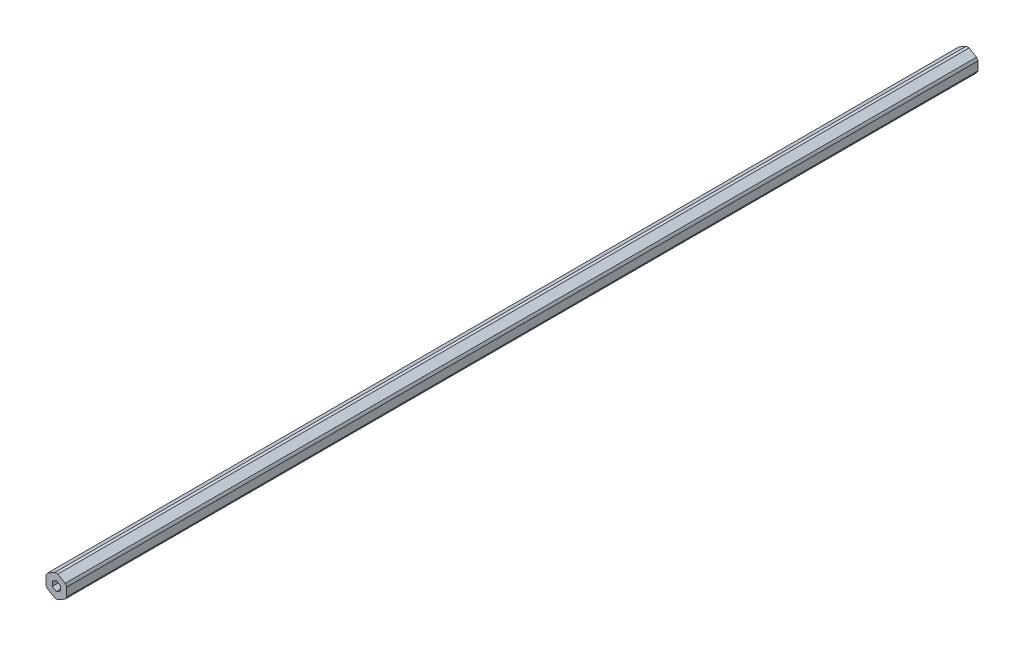
ISO-10303-21;
HEADER;
FILE_DESCRIPTION(('STEP AP214'),'2;1');
FILE_NAME('part.step','',(''),(''),'','','');
FILE_SCHEMA(('AUTOMOTIVE_DESIGN { 1 0 10303 214 1 1 1 1 }'));
ENDSEC;
DATA;
#1=APPLICATION_CONTEXT('core data for automotive mechanical design processes');
#2=APPLICATION_PROTOCOL_DEFINITION('international standard','automotive_design',2000,#1);
#3=PRODUCT_CONTEXT('',#1,'mechanical');
#4=PRODUCT('Part','Part','',(#3));
#5=PRODUCT_RELATED_PRODUCT_CATEGORY('part','',(#4));
#6=PRODUCT_DEFINITION_FORMATION('','',#4);
#7=PRODUCT_DEFINITION_CONTEXT('part definition',#1,'design');
#8=PRODUCT_DEFINITION('design','',#6,#7);
#9=PRODUCT_DEFINITION_SHAPE('','',#8);
#10=(LENGTH_UNIT() NAMED_UNIT(*) SI_UNIT(.MILLI.,.METRE.));
#11=(NAMED_UNIT(*) PLANE_ANGLE_UNIT() SI_UNIT($,.RADIAN.));
#12=(NAMED_UNIT(*) SI_UNIT($,.STERADIAN.) SOLID_ANGLE_UNIT());
#13=UNCERTAINTY_MEASURE_WITH_UNIT(LENGTH_MEASURE(1.E-05),#10,'distance_accuracy_value','');
#14=(GEOMETRIC_REPRESENTATION_CONTEXT(3) GLOBAL_UNCERTAINTY_ASSIGNED_CONTEXT((#13)) GLOBAL_UNIT_ASSIGNED_CONTEXT((#10,
#11,#12)) REPRESENTATION_CONTEXT('',''));
#15=CARTESIAN_POINT('',(0.,0.,0.));
#16=DIRECTION('',(0.,0.,1.));
#17=DIRECTION('',(1.,0.,0.));
#18=AXIS2_PLACEMENT_3D('',#15,#16,#17);
#19=CARTESIAN_POINT('',(0.,0.,457.2));
#20=DIRECTION('',(0.,0.,-1.));
#21=DIRECTION('',(-1.,0.,0.));
#22=AXIS2_PLACEMENT_3D('',#19,#20,#21);
#23=CYLINDRICAL_SURFACE('',#22,6.87);
#24=DIRECTION('',(0.,0.,-1.));
#25=VECTOR('',#24,1.);
#26=CARTESIAN_POINT('',(6.345,-2.63398462410091,457.2));
#27=LINE('',#26,#25);
#28=CARTESIAN_POINT('',(6.345,-2.63398462410091,101.6));
#29=VERTEX_POINT('',#28);
#30=CARTESIAN_POINT('',(6.345,-2.63398462410091,-457.2));
#31=VERTEX_POINT('',#30);
#32=EDGE_CURVE('E303',#29,#31,#27,.T.);
#33=ORIENTED_EDGE('',*,*,#32,.F.);
#34=CARTESIAN_POINT('',(0.,0.,101.6));
#35=DIRECTION('',(0.,0.,1.));
#36=DIRECTION('',(1.,0.,0.));
#37=AXIS2_PLACEMENT_3D('',#34,#35,#36);
#38=CIRCLE('',#37,6.87);
#39=CARTESIAN_POINT('',(5.45359759764899,-4.17793887496181,101.6));
#40=VERTEX_POINT('',#39);
#41=EDGE_CURVE('E247',#40,#29,#38,.T.);
#42=ORIENTED_EDGE('',*,*,#41,.F.);
#43=DIRECTION('',(0.,0.,-1.));
#44=VECTOR('',#43,1.);
#45=CARTESIAN_POINT('',(5.45359759764899,-4.17793887496181,457.2));
#46=LINE('',#45,#44);
#47=CARTESIAN_POINT('',(5.45359759764899,-4.17793887496181,-457.2));
#48=VERTEX_POINT('',#47);
#49=EDGE_CURVE('E57',#40,#48,#46,.T.);
#50=ORIENTED_EDGE('',*,*,#49,.T.);
#51=CARTESIAN_POINT('',(0.,0.,-457.2));
#52=DIRECTION('',(0.,0.,1.));
#53=DIRECTION('',(1.,0.,0.));
#54=AXIS2_PLACEMENT_3D('',#51,#52,#53);
#55=CIRCLE('',#54,6.87);
#56=EDGE_CURVE('E11',#48,#31,#55,.T.);
#57=ORIENTED_EDGE('',*,*,#56,.T.);
#58=EDGE_LOOP('',(#33,#42,#50,#57));
#59=FACE_BOUND('',#58,.T.);
#60=ADVANCED_FACE('F47',(#59),#23,.T.);
#61=CARTESIAN_POINT('',(3.1725,-5.49493118701227,457.2));
#62=DIRECTION('',(-0.5,0.866025403784439,0.));
#63=DIRECTION('',(0.,0.,1.));
#64=AXIS2_PLACEMENT_3D('',#61,#62,#63);
#65=PLANE('',#64);
#66=DIRECTION('',(0.866025403784438,0.5,0.));
#67=VECTOR('',#66,1.);
#68=CARTESIAN_POINT('',(0.891402402351005,-6.81192349906272,101.6));
#69=LINE('',#68,#67);
#70=CARTESIAN_POINT('',(0.891402402351005,-6.81192349906272,101.6));
#71=VERTEX_POINT('',#70);
#72=EDGE_CURVE('E291',#71,#40,#69,.T.);
#73=ORIENTED_EDGE('',*,*,#72,.F.);
#74=DIRECTION('',(0.,0.,-1.));
#75=VECTOR('',#74,1.);
#76=CARTESIAN_POINT('',(0.891402402351008,-6.81192349906272,457.2));
#77=LINE('',#76,#75);
#78=CARTESIAN_POINT('',(0.891402402351008,-6.81192349906272,-457.2));
#79=VERTEX_POINT('',#78);
#80=EDGE_CURVE('E321',#71,#79,#77,.T.);
#81=ORIENTED_EDGE('',*,*,#80,.T.);
#82=DIRECTION('',(0.866025403784439,0.5,0.));
#83=VECTOR('',#82,1.);
#84=CARTESIAN_POINT('',(3.1725,-5.49493118701227,-457.2));
#85=LINE('',#84,#83);
#86=EDGE_CURVE('E317',#79,#48,#85,.T.);
#87=ORIENTED_EDGE('',*,*,#86,.T.);
#88=ORIENTED_EDGE('',*,*,#49,.F.);
#89=EDGE_LOOP('',(#73,#81,#87,#88));
#90=FACE_BOUND('',#89,.T.);
#91=ADVANCED_FACE('F568',(#90),#65,.F.);
#92=CARTESIAN_POINT('',(0.,0.,457.2));
#93=DIRECTION('',(0.,0.,-1.));
#94=DIRECTION('',(-1.,0.,0.));
#95=AXIS2_PLACEMENT_3D('',#92,#93,#94);
#96=CYLINDRICAL_SURFACE('',#95,6.87);
#97=ORIENTED_EDGE('',*,*,#80,.F.);
#98=CARTESIAN_POINT('',(0.,0.,101.6));
#99=DIRECTION('',(0.,0.,1.));
#100=DIRECTION('',(1.,0.,0.));
#101=AXIS2_PLACEMENT_3D('',#98,#99,#100);
#102=CIRCLE('',#101,6.87);
#103=CARTESIAN_POINT('',(-0.891402402351014,-6.81192349906272,101.6));
#104=VERTEX_POINT('',#103);
#105=EDGE_CURVE('E288',#104,#71,#102,.T.);
#106=ORIENTED_EDGE('',*,*,#105,.F.);
#107=DIRECTION('',(0.,0.,-1.));
#108=VECTOR('',#107,1.);
#109=CARTESIAN_POINT('',(-0.891402402351014,-6.81192349906272,457.2));
#110=LINE('',#109,#108);
#111=CARTESIAN_POINT('',(-0.891402402351014,-6.81192349906272,-457.2));
#112=VERTEX_POINT('',#111);
#113=EDGE_CURVE('E308',#104,#112,#110,.T.);
#114=ORIENTED_EDGE('',*,*,#113,.T.);
#115=CARTESIAN_POINT('',(0.,0.,-457.2));
#116=DIRECTION('',(0.,0.,1.));
#117=DIRECTION('',(1.,0.,0.));
#118=AXIS2_PLACEMENT_3D('',#115,#116,#117);
#119=CIRCLE('',#118,6.87);
#120=EDGE_CURVE('E311',#112,#79,#119,.T.);
#121=ORIENTED_EDGE('',*,*,#120,.T.);
#122=EDGE_LOOP('',(#97,#106,#114,#121));
#123=FACE_BOUND('',#122,.T.);
#124=ADVANCED_FACE('F49',(#123),#96,.T.);
#125=CARTESIAN_POINT('',(-3.1725,-5.49493118701226,457.2));
#126=DIRECTION('',(0.5,0.866025403784439,0.));
#127=DIRECTION('',(0.,0.,-1.));
#128=AXIS2_PLACEMENT_3D('',#125,#126,#127);
#129=PLANE('',#128);
#130=DIRECTION('',(0.866025403784438,-0.500000000000001,0.));
#131=VECTOR('',#130,1.);
#132=CARTESIAN_POINT('',(-5.45359759764899,-4.17793887496181,101.6));
#133=LINE('',#132,#131);
#134=CARTESIAN_POINT('',(-5.45359759764899,-4.17793887496181,101.6));
#135=VERTEX_POINT('',#134);
#136=EDGE_CURVE('E285',#135,#104,#133,.T.);
#137=ORIENTED_EDGE('',*,*,#136,.F.);
#138=DIRECTION('',(0.,0.,-1.));
#139=VECTOR('',#138,1.);
#140=CARTESIAN_POINT('',(-5.45359759764899,-4.17793887496181,457.2));
#141=LINE('',#140,#139);
#142=CARTESIAN_POINT('',(-5.45359759764899,-4.17793887496181,-457.2));
#143=VERTEX_POINT('',#142);
#144=EDGE_CURVE('E316',#135,#143,#141,.T.);
#145=ORIENTED_EDGE('',*,*,#144,.T.);
#146=DIRECTION('',(0.866025403784439,-0.5,0.));
#147=VECTOR('',#146,1.);
#148=CARTESIAN_POINT('',(-3.1725,-5.49493118701226,-457.2));
#149=LINE('',#148,#147);
#150=EDGE_CURVE('E312',#143,#112,#149,.T.);
#151=ORIENTED_EDGE('',*,*,#150,.T.);
#152=ORIENTED_EDGE('',*,*,#113,.F.);
#153=EDGE_LOOP('',(#137,#145,#151,#152));
#154=FACE_BOUND('',#153,.T.);
#155=ADVANCED_FACE('F551',(#154),#129,.F.);
#156=CARTESIAN_POINT('',(0.,0.,457.2));
#157=DIRECTION('',(0.,0.,-1.));
#158=DIRECTION('',(-1.,0.,0.));
#159=AXIS2_PLACEMENT_3D('',#156,#157,#158);
#160=CYLINDRICAL_SURFACE('',#159,6.87);
#161=ORIENTED_EDGE('',*,*,#144,.F.);
#162=CARTESIAN_POINT('',(0.,0.,101.6));
#163=DIRECTION('',(0.,0.,1.));
#164=DIRECTION('',(1.,0.,0.));
#165=AXIS2_PLACEMENT_3D('',#162,#163,#164);
#166=CIRCLE('',#165,6.87);
#167=CARTESIAN_POINT('',(-6.345,-2.63398462410091,101.6));
#168=VERTEX_POINT('',#167);
#169=EDGE_CURVE('E282',#168,#135,#166,.T.);
#170=ORIENTED_EDGE('',*,*,#169,.F.);
#171=DIRECTION('',(0.,0.,-1.));
#172=VECTOR('',#171,1.);
#173=CARTESIAN_POINT('',(-6.345,-2.63398462410091,457.2));
#174=LINE('',#173,#172);
#175=CARTESIAN_POINT('',(-6.345,-2.63398462410091,-457.2));
#176=VERTEX_POINT('',#175);
#177=EDGE_CURVE('E343',#168,#176,#174,.T.);
#178=ORIENTED_EDGE('',*,*,#177,.T.);
#179=CARTESIAN_POINT('',(0.,0.,-457.2));
#180=DIRECTION('',(0.,0.,1.));
#181=DIRECTION('',(1.,0.,0.));
#182=AXIS2_PLACEMENT_3D('',#179,#180,#181);
#183=CIRCLE('',#182,6.87);
#184=EDGE_CURVE('E344',#176,#143,#183,.T.);
#185=ORIENTED_EDGE('',*,*,#184,.T.);
#186=EDGE_LOOP('',(#161,#170,#178,#185));
#187=FACE_BOUND('',#186,.T.);
#188=ADVANCED_FACE('F542',(#187),#160,.T.);
#189=CARTESIAN_POINT('',(-6.345,0.,457.2));
#190=DIRECTION('',(1.,0.,0.));
#191=DIRECTION('',(0.,1.,0.));
#192=AXIS2_PLACEMENT_3D('',#189,#190,#191);
#193=PLANE('',#192);
#194=DIRECTION('',(0.,-1.,0.));
#195=VECTOR('',#194,1.);
#196=CARTESIAN_POINT('',(-6.345,2.63398462410091,101.6));
#197=LINE('',#196,#195);
#198=CARTESIAN_POINT('',(-6.34500000000001,2.63398462410091,101.6));
#199=VERTEX_POINT('',#198);
#200=EDGE_CURVE('E279',#199,#168,#197,.T.);
#201=ORIENTED_EDGE('',*,*,#200,.F.);
#202=DIRECTION('',(0.,0.,-1.));
#203=VECTOR('',#202,1.);
#204=CARTESIAN_POINT('',(-6.345,2.63398462410091,457.2));
#205=LINE('',#204,#203);
#206=CARTESIAN_POINT('',(-6.345,2.63398462410091,-457.2));
#207=VERTEX_POINT('',#206);
#208=EDGE_CURVE('E333',#199,#207,#205,.T.);
#209=ORIENTED_EDGE('',*,*,#208,.T.);
#210=DIRECTION('',(0.,-1.,0.));
#211=VECTOR('',#210,1.);
#212=CARTESIAN_POINT('',(-6.345,0.,-457.2));
#213=LINE('',#212,#211);
#214=EDGE_CURVE('E336',#207,#176,#213,.T.);
#215=ORIENTED_EDGE('',*,*,#214,.T.);
#216=ORIENTED_EDGE('',*,*,#177,.F.);
#217=EDGE_LOOP('',(#201,#209,#215,#216));
#218=FACE_BOUND('',#217,.T.);
#219=ADVANCED_FACE('F535',(#218),#193,.F.);
#220=CARTESIAN_POINT('',(0.,0.,457.2));
#221=DIRECTION('',(0.,0.,-1.));
#222=DIRECTION('',(-1.,0.,0.));
#223=AXIS2_PLACEMENT_3D('',#220,#221,#222);
#224=CYLINDRICAL_SURFACE('',#223,6.87);
#225=ORIENTED_EDGE('',*,*,#208,.F.);
#226=CARTESIAN_POINT('',(0.,0.,101.6));
#227=DIRECTION('',(0.,0.,1.));
#228=DIRECTION('',(1.,0.,0.));
#229=AXIS2_PLACEMENT_3D('',#226,#227,#228);
#230=CIRCLE('',#229,6.87);
#231=CARTESIAN_POINT('',(-5.45359759764899,4.17793887496182,101.6));
#232=VERTEX_POINT('',#231);
#233=EDGE_CURVE('E276',#232,#199,#230,.T.);
#234=ORIENTED_EDGE('',*,*,#233,.F.);
#235=DIRECTION('',(0.,0.,-1.));
#236=VECTOR('',#235,1.);
#237=CARTESIAN_POINT('',(-5.45359759764899,4.17793887496182,457.2));
#238=LINE('',#237,#236);
#239=CARTESIAN_POINT('',(-5.45359759764899,4.17793887496182,-457.2));
#240=VERTEX_POINT('',#239);
#241=EDGE_CURVE('E307',#232,#240,#238,.T.);
#242=ORIENTED_EDGE('',*,*,#241,.T.);
#243=CARTESIAN_POINT('',(0.,0.,-457.2));
#244=DIRECTION('',(0.,0.,1.));
#245=DIRECTION('',(1.,0.,0.));
#246=AXIS2_PLACEMENT_3D('',#243,#244,#245);
#247=CIRCLE('',#246,6.87);
#248=EDGE_CURVE('E337',#240,#207,#247,.T.);
#249=ORIENTED_EDGE('',*,*,#248,.T.);
#250=EDGE_LOOP('',(#225,#234,#242,#249));
#251=FACE_BOUND('',#250,.T.);
#252=ADVANCED_FACE('F372',(#251),#224,.T.);
#253=CARTESIAN_POINT('',(-3.1725,5.49493118701227,457.2));
#254=DIRECTION('',(0.5,-0.866025403784439,0.));
#255=DIRECTION('',(0.,0.,-1.));
#256=AXIS2_PLACEMENT_3D('',#253,#254,#255);
#257=PLANE('',#256);
#258=DIRECTION('',(-0.866025403784439,-0.5,0.));
#259=VECTOR('',#258,1.);
#260=CARTESIAN_POINT('',(-0.891402402351017,6.81192349906272,101.6));
#261=LINE('',#260,#259);
#262=CARTESIAN_POINT('',(-0.891402402351017,6.81192349906272,101.6));
#263=VERTEX_POINT('',#262);
#264=EDGE_CURVE('E273',#263,#232,#261,.T.);
#265=ORIENTED_EDGE('',*,*,#264,.F.);
#266=DIRECTION('',(0.,0.,-1.));
#267=VECTOR('',#266,1.);
#268=CARTESIAN_POINT('',(-0.891402402351017,6.81192349906272,457.2));
#269=LINE('',#268,#267);
#270=CARTESIAN_POINT('',(-0.891402402351017,6.81192349906272,-457.2));
#271=VERTEX_POINT('',#270);
#272=EDGE_CURVE('E295',#263,#271,#269,.T.);
#273=ORIENTED_EDGE('',*,*,#272,.T.);
#274=DIRECTION('',(-0.866025403784439,-0.5,0.));
#275=VECTOR('',#274,1.);
#276=CARTESIAN_POINT('',(-3.1725,5.49493118701227,-457.2));
#277=LINE('',#276,#275);
#278=EDGE_CURVE('E298',#271,#240,#277,.T.);
#279=ORIENTED_EDGE('',*,*,#278,.T.);
#280=ORIENTED_EDGE('',*,*,#241,.F.);
#281=EDGE_LOOP('',(#265,#273,#279,#280));
#282=FACE_BOUND('',#281,.T.);
#283=ADVANCED_FACE('F382',(#282),#257,.F.);
#284=CARTESIAN_POINT('',(0.,0.,457.2));
#285=DIRECTION('',(0.,0.,-1.));
#286=DIRECTION('',(-1.,0.,0.));
#287=AXIS2_PLACEMENT_3D('',#284,#285,#286);
#288=CYLINDRICAL_SURFACE('',#287,6.87);
#289=ORIENTED_EDGE('',*,*,#272,.F.);
#290=CARTESIAN_POINT('',(0.,0.,101.6));
#291=DIRECTION('',(0.,0.,1.));
#292=DIRECTION('',(1.,0.,0.));
#293=AXIS2_PLACEMENT_3D('',#290,#291,#292);
#294=CIRCLE('',#293,6.87);
#295=CARTESIAN_POINT('',(0.891402402351022,6.81192349906272,101.6));
#296=VERTEX_POINT('',#295);
#297=EDGE_CURVE('E270',#296,#263,#294,.T.);
#298=ORIENTED_EDGE('',*,*,#297,.F.);
#299=DIRECTION('',(0.,0.,-1.));
#300=VECTOR('',#299,1.);
#301=CARTESIAN_POINT('',(0.891402402351022,6.81192349906272,457.2));
#302=LINE('',#301,#300);
#303=CARTESIAN_POINT('',(0.891402402351022,6.81192349906272,-457.2));
#304=VERTEX_POINT('',#303);
#305=EDGE_CURVE('E322',#296,#304,#302,.T.);
#306=ORIENTED_EDGE('',*,*,#305,.T.);
#307=CARTESIAN_POINT('',(0.,0.,-457.2));
#308=DIRECTION('',(0.,0.,1.));
#309=DIRECTION('',(1.,0.,0.));
#310=AXIS2_PLACEMENT_3D('',#307,#308,#309);
#311=CIRCLE('',#310,6.87);
#312=EDGE_CURVE('E299',#304,#271,#311,.T.);
#313=ORIENTED_EDGE('',*,*,#312,.T.);
#314=EDGE_LOOP('',(#289,#298,#306,#313));
#315=FACE_BOUND('',#314,.T.);
#316=ADVANCED_FACE('F386',(#315),#288,.T.);
#317=CARTESIAN_POINT('',(3.1725,5.49493118701227,457.2));
#318=DIRECTION('',(-0.5,-0.866025403784439,0.));
#319=DIRECTION('',(-0.866025403784439,0.5,0.));
#320=AXIS2_PLACEMENT_3D('',#317,#318,#319);
#321=PLANE('',#320);
#322=DIRECTION('',(-0.866025403784438,0.500000000000001,0.));
#323=VECTOR('',#322,1.);
#324=CARTESIAN_POINT('',(5.45359759764898,4.17793887496182,101.6));
#325=LINE('',#324,#323);
#326=CARTESIAN_POINT('',(5.45359759764898,4.17793887496182,101.6));
#327=VERTEX_POINT('',#326);
#328=EDGE_CURVE('E267',#327,#296,#325,.T.);
#329=ORIENTED_EDGE('',*,*,#328,.F.);
#330=DIRECTION('',(0.,0.,-1.));
#331=VECTOR('',#330,1.);
#332=CARTESIAN_POINT('',(5.45359759764898,4.17793887496182,457.2));
#333=LINE('',#332,#331);
#334=CARTESIAN_POINT('',(5.45359759764898,4.17793887496182,-457.2));
#335=VERTEX_POINT('',#334);
#336=EDGE_CURVE('E329',#327,#335,#333,.T.);
#337=ORIENTED_EDGE('',*,*,#336,.T.);
#338=DIRECTION('',(-0.866025403784439,0.5,0.));
#339=VECTOR('',#338,1.);
#340=CARTESIAN_POINT('',(3.1725,5.49493118701227,-457.2));
#341=LINE('',#340,#339);
#342=EDGE_CURVE('E325',#335,#304,#341,.T.);
#343=ORIENTED_EDGE('',*,*,#342,.T.);
#344=ORIENTED_EDGE('',*,*,#305,.F.);
#345=EDGE_LOOP('',(#329,#337,#343,#344));
#346=FACE_BOUND('',#345,.T.);
#347=ADVANCED_FACE('F393',(#346),#321,.F.);
#348=CARTESIAN_POINT('',(0.,0.,457.2));
#349=DIRECTION('',(0.,0.,-1.));
#350=DIRECTION('',(-1.,0.,0.));
#351=AXIS2_PLACEMENT_3D('',#348,#349,#350);
#352=CYLINDRICAL_SURFACE('',#351,6.87);
#353=ORIENTED_EDGE('',*,*,#336,.F.);
#354=CARTESIAN_POINT('',(0.,0.,101.6));
#355=DIRECTION('',(0.,0.,1.));
#356=DIRECTION('',(1.,0.,0.));
#357=AXIS2_PLACEMENT_3D('',#354,#355,#356);
#358=CIRCLE('',#357,6.87);
#359=CARTESIAN_POINT('',(6.345,2.63398462410091,101.6));
#360=VERTEX_POINT('',#359);
#361=EDGE_CURVE('E264',#360,#327,#358,.T.);
#362=ORIENTED_EDGE('',*,*,#361,.F.);
#363=DIRECTION('',(0.,0.,-1.));
#364=VECTOR('',#363,1.);
#365=CARTESIAN_POINT('',(6.345,2.63398462410091,457.2));
#366=LINE('',#365,#364);
#367=CARTESIAN_POINT('',(6.345,2.63398462410091,-457.2));
#368=VERTEX_POINT('',#367);
#369=EDGE_CURVE('E300',#360,#368,#366,.T.);
#370=ORIENTED_EDGE('',*,*,#369,.T.);
#371=CARTESIAN_POINT('',(0.,0.,-457.2));
#372=DIRECTION('',(0.,0.,1.));
#373=DIRECTION('',(1.,0.,0.));
#374=AXIS2_PLACEMENT_3D('',#371,#372,#373);
#375=CIRCLE('',#374,6.87);
#376=EDGE_CURVE('E51',#368,#335,#375,.T.);
#377=ORIENTED_EDGE('',*,*,#376,.T.);
#378=EDGE_LOOP('',(#353,#362,#370,#377));
#379=FACE_BOUND('',#378,.T.);
#380=ADVANCED_FACE('F397',(#379),#352,.T.);
#381=CARTESIAN_POINT('',(6.345,0.,457.2));
#382=DIRECTION('',(-1.,0.,0.));
#383=DIRECTION('',(0.,1.,0.));
#384=AXIS2_PLACEMENT_3D('',#381,#382,#383);
#385=PLANE('',#384);
#386=DIRECTION('',(0.,1.,0.));
#387=VECTOR('',#386,1.);
#388=CARTESIAN_POINT('',(6.345,-2.63398462410091,101.6));
#389=LINE('',#388,#387);
#390=EDGE_CURVE('E261',#29,#360,#389,.T.);
#391=ORIENTED_EDGE('',*,*,#390,.F.);
#392=ORIENTED_EDGE('',*,*,#32,.T.);
#393=DIRECTION('',(0.,1.,0.));
#394=VECTOR('',#393,1.);
#395=CARTESIAN_POINT('',(6.345,0.,-457.2));
#396=LINE('',#395,#394);
#397=EDGE_CURVE('E294',#31,#368,#396,.T.);
#398=ORIENTED_EDGE('',*,*,#397,.T.);
#399=ORIENTED_EDGE('',*,*,#369,.F.);
#400=EDGE_LOOP('',(#391,#392,#398,#399));
#401=FACE_BOUND('',#400,.T.);
#402=ADVANCED_FACE('F474',(#401),#385,.F.);
#403=CARTESIAN_POINT('',(0.,0.,-457.2));
#404=DIRECTION('',(0.,0.,1.));
#405=DIRECTION('',(1.,0.,0.));
#406=AXIS2_PLACEMENT_3D('',#403,#404,#405);
#407=PLANE('',#406);
#408=DIRECTION('',(0.866025403784439,-0.5,0.));
#409=VECTOR('',#408,1.);
#410=CARTESIAN_POINT('',(-2.5,-1.44337567297406,-457.2));
#411=LINE('',#410,#409);
#412=CARTESIAN_POINT('',(-2.5,-1.44337567297406,-457.2));
#413=VERTEX_POINT('',#412);
#414=CARTESIAN_POINT('',(0.,-2.88675134594813,-457.2));
#415=VERTEX_POINT('',#414);
#416=EDGE_CURVE('E196',#413,#415,#411,.T.);
#417=ORIENTED_EDGE('',*,*,#416,.T.);
#418=DIRECTION('',(0.866025403784438,0.500000000000001,0.));
#419=VECTOR('',#418,1.);
#420=CARTESIAN_POINT('',(0.,-2.88675134594813,-457.2));
#421=LINE('',#420,#419);
#422=CARTESIAN_POINT('',(2.5,-1.44337567297406,-457.2));
#423=VERTEX_POINT('',#422);
#424=EDGE_CURVE('E189',#415,#423,#421,.T.);
#425=ORIENTED_EDGE('',*,*,#424,.T.);
#426=DIRECTION('',(0.,1.,0.));
#427=VECTOR('',#426,1.);
#428=CARTESIAN_POINT('',(2.5,-1.44337567297406,-457.2));
#429=LINE('',#428,#427);
#430=CARTESIAN_POINT('',(2.5,1.44337567297407,-457.2));
#431=VERTEX_POINT('',#430);
#432=EDGE_CURVE('E199',#423,#431,#429,.T.);
#433=ORIENTED_EDGE('',*,*,#432,.T.);
#434=DIRECTION('',(-0.866025403784439,0.5,0.));
#435=VECTOR('',#434,1.);
#436=CARTESIAN_POINT('',(2.5,1.44337567297407,-457.2));
#437=LINE('',#436,#435);
#438=CARTESIAN_POINT('',(0.,2.88675134594813,-457.2));
#439=VERTEX_POINT('',#438);
#440=EDGE_CURVE('E65',#431,#439,#437,.T.);
#441=ORIENTED_EDGE('',*,*,#440,.T.);
#442=DIRECTION('',(-0.866025403784439,-0.5,0.));
#443=VECTOR('',#442,1.);
#444=CARTESIAN_POINT('',(0.,2.88675134594813,-457.2));
#445=LINE('',#444,#443);
#446=CARTESIAN_POINT('',(-2.5,1.44337567297406,-457.2));
#447=VERTEX_POINT('',#446);
#448=EDGE_CURVE('E219',#439,#447,#445,.T.);
#449=ORIENTED_EDGE('',*,*,#448,.T.);
#450=DIRECTION('',(0.,-1.,0.));
#451=VECTOR('',#450,1.);
#452=CARTESIAN_POINT('',(-2.5,1.44337567297406,-457.2));
#453=LINE('',#452,#451);
#454=EDGE_CURVE('E223',#447,#413,#453,.T.);
#455=ORIENTED_EDGE('',*,*,#454,.T.);
#456=EDGE_LOOP('',(#417,#425,#433,#441,#449,#455));
#457=FACE_BOUND('',#456,.T.);
#458=ORIENTED_EDGE('',*,*,#397,.F.);
#459=ORIENTED_EDGE('',*,*,#56,.F.);
#460=ORIENTED_EDGE('',*,*,#86,.F.);
#461=ORIENTED_EDGE('',*,*,#120,.F.);
#462=ORIENTED_EDGE('',*,*,#150,.F.);
#463=ORIENTED_EDGE('',*,*,#184,.F.);
#464=ORIENTED_EDGE('',*,*,#214,.F.);
#465=ORIENTED_EDGE('',*,*,#248,.F.);
#466=ORIENTED_EDGE('',*,*,#278,.F.);
#467=ORIENTED_EDGE('',*,*,#312,.F.);
#468=ORIENTED_EDGE('',*,*,#342,.F.);
#469=ORIENTED_EDGE('',*,*,#376,.F.);
#470=EDGE_LOOP('',(#458,#459,#460,#461,#462,#463,#464,#465,#466,#467,#468,#469));
#471=FACE_BOUND('',#470,.T.);
#472=ADVANCED_FACE('F204',(#457,#471),#407,.F.);
#473=CARTESIAN_POINT('',(0.,0.,101.6));
#474=DIRECTION('',(0.,0.,1.));
#475=DIRECTION('',(1.,0.,0.));
#476=AXIS2_PLACEMENT_3D('',#473,#474,#475);
#477=PLANE('',#476);
#478=DIRECTION('',(0.866025403784438,0.500000000000001,0.));
#479=VECTOR('',#478,1.);
#480=CARTESIAN_POINT('',(0.,-2.88675134594813,101.6));
#481=LINE('',#480,#479);
#482=CARTESIAN_POINT('',(0.,-2.88675134594813,101.6));
#483=VERTEX_POINT('',#482);
#484=CARTESIAN_POINT('',(2.5,-1.44337567297406,101.6));
#485=VERTEX_POINT('',#484);
#486=EDGE_CURVE('E73',#483,#485,#481,.T.);
#487=ORIENTED_EDGE('',*,*,#486,.F.);
#488=DIRECTION('',(0.866025403784439,-0.5,0.));
#489=VECTOR('',#488,1.);
#490=CARTESIAN_POINT('',(-2.5,-1.44337567297406,101.6));
#491=LINE('',#490,#489);
#492=CARTESIAN_POINT('',(-2.5,-1.44337567297406,101.6));
#493=VERTEX_POINT('',#492);
#494=EDGE_CURVE('E209',#493,#483,#491,.T.);
#495=ORIENTED_EDGE('',*,*,#494,.F.);
#496=DIRECTION('',(0.,-1.,0.));
#497=VECTOR('',#496,1.);
#498=CARTESIAN_POINT('',(-2.5,1.44337567297406,101.6));
#499=LINE('',#498,#497);
#500=CARTESIAN_POINT('',(-2.5,1.44337567297406,101.6));
#501=VERTEX_POINT('',#500);
#502=EDGE_CURVE('E214',#501,#493,#499,.T.);
#503=ORIENTED_EDGE('',*,*,#502,.F.);
#504=DIRECTION('',(-0.866025403784439,-0.5,0.));
#505=VECTOR('',#504,1.);
#506=CARTESIAN_POINT('',(0.,2.88675134594813,101.6));
#507=LINE('',#506,#505);
#508=CARTESIAN_POINT('',(0.,2.88675134594813,101.6));
#509=VERTEX_POINT('',#508);
#510=EDGE_CURVE('E237',#509,#501,#507,.T.);
#511=ORIENTED_EDGE('',*,*,#510,.F.);
#512=DIRECTION('',(-0.866025403784439,0.5,0.));
#513=VECTOR('',#512,1.);
#514=CARTESIAN_POINT('',(2.5,1.44337567297407,101.6));
#515=LINE('',#514,#513);
#516=CARTESIAN_POINT('',(2.5,1.44337567297407,101.6));
#517=VERTEX_POINT('',#516);
#518=EDGE_CURVE('E233',#517,#509,#515,.T.);
#519=ORIENTED_EDGE('',*,*,#518,.F.);
#520=DIRECTION('',(0.,1.,0.));
#521=VECTOR('',#520,1.);
#522=CARTESIAN_POINT('',(2.5,-1.44337567297406,101.6));
#523=LINE('',#522,#521);
#524=EDGE_CURVE('E230',#485,#517,#523,.T.);
#525=ORIENTED_EDGE('',*,*,#524,.F.);
#526=EDGE_LOOP('',(#487,#495,#503,#511,#519,#525));
#527=FACE_BOUND('',#526,.T.);
#528=ORIENTED_EDGE('',*,*,#41,.T.);
#529=ORIENTED_EDGE('',*,*,#390,.T.);
#530=ORIENTED_EDGE('',*,*,#361,.T.);
#531=ORIENTED_EDGE('',*,*,#328,.T.);
#532=ORIENTED_EDGE('',*,*,#297,.T.);
#533=ORIENTED_EDGE('',*,*,#264,.T.);
#534=ORIENTED_EDGE('',*,*,#233,.T.);
#535=ORIENTED_EDGE('',*,*,#200,.T.);
#536=ORIENTED_EDGE('',*,*,#169,.T.);
#537=ORIENTED_EDGE('',*,*,#136,.T.);
#538=ORIENTED_EDGE('',*,*,#105,.T.);
#539=ORIENTED_EDGE('',*,*,#72,.T.);
#540=EDGE_LOOP('',(#528,#529,#530,#531,#532,#533,#534,#535,#536,#537,#538,#539));
#541=FACE_BOUND('',#540,.T.);
#542=ADVANCED_FACE('F473',(#527,#541),#477,.T.);
#543=CARTESIAN_POINT('',(0.,-2.88675134594813,-457.2));
#544=DIRECTION('',(0.500000000000001,-0.866025403784438,0.));
#545=DIRECTION('',(0.866025403784438,0.500000000000001,0.));
#546=AXIS2_PLACEMENT_3D('',#543,#544,#545);
#547=PLANE('',#546);
#548=ORIENTED_EDGE('',*,*,#486,.T.);
#549=DIRECTION('',(0.,0.,1.));
#550=VECTOR('',#549,1.);
#551=CARTESIAN_POINT('',(2.5,-1.44337567297406,-457.2));
#552=LINE('',#551,#550);
#553=EDGE_CURVE('E185',#423,#485,#552,.T.);
#554=ORIENTED_EDGE('',*,*,#553,.F.);
#555=ORIENTED_EDGE('',*,*,#424,.F.);
#556=DIRECTION('',(0.,0.,1.));
#557=VECTOR('',#556,1.);
#558=CARTESIAN_POINT('',(0.,-2.88675134594813,-457.2));
#559=LINE('',#558,#557);
#560=EDGE_CURVE('E244',#415,#483,#559,.T.);
#561=ORIENTED_EDGE('',*,*,#560,.T.);
#562=EDGE_LOOP('',(#548,#554,#555,#561));
#563=FACE_BOUND('',#562,.T.);
#564=ADVANCED_FACE('F187',(#563),#547,.F.);
#565=CARTESIAN_POINT('',(-2.5,-1.44337567297406,-457.2));
#566=DIRECTION('',(-0.5,-0.866025403784439,0.));
#567=DIRECTION('',(0.866025403784439,-0.5,0.));
#568=AXIS2_PLACEMENT_3D('',#565,#566,#567);
#569=PLANE('',#568);
#570=ORIENTED_EDGE('',*,*,#494,.T.);
#571=ORIENTED_EDGE('',*,*,#560,.F.);
#572=ORIENTED_EDGE('',*,*,#416,.F.);
#573=DIRECTION('',(0.,0.,1.));
#574=VECTOR('',#573,1.);
#575=CARTESIAN_POINT('',(-2.5,-1.44337567297406,-457.2));
#576=LINE('',#575,#574);
#577=EDGE_CURVE('E248',#413,#493,#576,.T.);
#578=ORIENTED_EDGE('',*,*,#577,.T.);
#579=EDGE_LOOP('',(#570,#571,#572,#578));
#580=FACE_BOUND('',#579,.T.);
#581=ADVANCED_FACE('F599',(#580),#569,.F.);
#582=CARTESIAN_POINT('',(-2.5,1.44337567297406,-457.2));
#583=DIRECTION('',(-1.,0.,0.));
#584=DIRECTION('',(0.,-1.,0.));
#585=AXIS2_PLACEMENT_3D('',#582,#583,#584);
#586=PLANE('',#585);
#587=ORIENTED_EDGE('',*,*,#502,.T.);
#588=ORIENTED_EDGE('',*,*,#577,.F.);
#589=ORIENTED_EDGE('',*,*,#454,.F.);
#590=DIRECTION('',(0.,0.,1.));
#591=VECTOR('',#590,1.);
#592=CARTESIAN_POINT('',(-2.5,1.44337567297406,-457.2));
#593=LINE('',#592,#591);
#594=EDGE_CURVE('E251',#447,#501,#593,.T.);
#595=ORIENTED_EDGE('',*,*,#594,.T.);
#596=EDGE_LOOP('',(#587,#588,#589,#595));
#597=FACE_BOUND('',#596,.T.);
#598=ADVANCED_FACE('F607',(#597),#586,.F.);
#599=CARTESIAN_POINT('',(0.,2.88675134594813,-457.2));
#600=DIRECTION('',(-0.5,0.866025403784439,0.));
#601=DIRECTION('',(-0.866025403784439,-0.5,0.));
#602=AXIS2_PLACEMENT_3D('',#599,#600,#601);
#603=PLANE('',#602);
#604=ORIENTED_EDGE('',*,*,#510,.T.);
#605=ORIENTED_EDGE('',*,*,#594,.F.);
#606=ORIENTED_EDGE('',*,*,#448,.F.);
#607=DIRECTION('',(0.,0.,1.));
#608=VECTOR('',#607,1.);
#609=CARTESIAN_POINT('',(0.,2.88675134594813,-457.2));
#610=LINE('',#609,#608);
#611=EDGE_CURVE('E254',#439,#509,#610,.T.);
#612=ORIENTED_EDGE('',*,*,#611,.T.);
#613=EDGE_LOOP('',(#604,#605,#606,#612));
#614=FACE_BOUND('',#613,.T.);
#615=ADVANCED_FACE('F616',(#614),#603,.F.);
#616=CARTESIAN_POINT('',(2.5,1.44337567297407,-457.2));
#617=DIRECTION('',(0.5,0.866025403784439,0.));
#618=DIRECTION('',(-0.866025403784439,0.5,0.));
#619=AXIS2_PLACEMENT_3D('',#616,#617,#618);
#620=PLANE('',#619);
#621=ORIENTED_EDGE('',*,*,#518,.T.);
#622=ORIENTED_EDGE('',*,*,#611,.F.);
#623=ORIENTED_EDGE('',*,*,#440,.F.);
#624=DIRECTION('',(0.,0.,1.));
#625=VECTOR('',#624,1.);
#626=CARTESIAN_POINT('',(2.5,1.44337567297407,-457.2));
#627=LINE('',#626,#625);
#628=EDGE_CURVE('E195',#431,#517,#627,.T.);
#629=ORIENTED_EDGE('',*,*,#628,.T.);
#630=EDGE_LOOP('',(#621,#622,#623,#629));
#631=FACE_BOUND('',#630,.T.);
#632=ADVANCED_FACE('F625',(#631),#620,.F.);
#633=CARTESIAN_POINT('',(2.5,-1.44337567297406,-457.2));
#634=DIRECTION('',(1.,0.,0.));
#635=DIRECTION('',(0.,0.,-1.));
#636=AXIS2_PLACEMENT_3D('',#633,#634,#635);
#637=PLANE('',#636);
#638=ORIENTED_EDGE('',*,*,#524,.T.);
#639=ORIENTED_EDGE('',*,*,#628,.F.);
#640=ORIENTED_EDGE('',*,*,#432,.F.);
#641=ORIENTED_EDGE('',*,*,#553,.T.);
#642=EDGE_LOOP('',(#638,#639,#640,#641));
#643=FACE_BOUND('',#642,.T.);
#644=ADVANCED_FACE('F200',(#643),#637,.F.);
#645=CLOSED_SHELL('',(#60,#91,#124,#155,#188,#219,#252,#283,#316,#347,#380,#402,#472,#542,#564,
#581,#598,#615,#632,#644));
#646=MANIFOLD_SOLID_BREP('B2',#645);
#647=ADVANCED_BREP_SHAPE_REPRESENTATION('',(#18,#646),#14);
#648=SHAPE_DEFINITION_REPRESENTATION(#9,#647);
ENDSEC;
END-ISO-10303-21;
